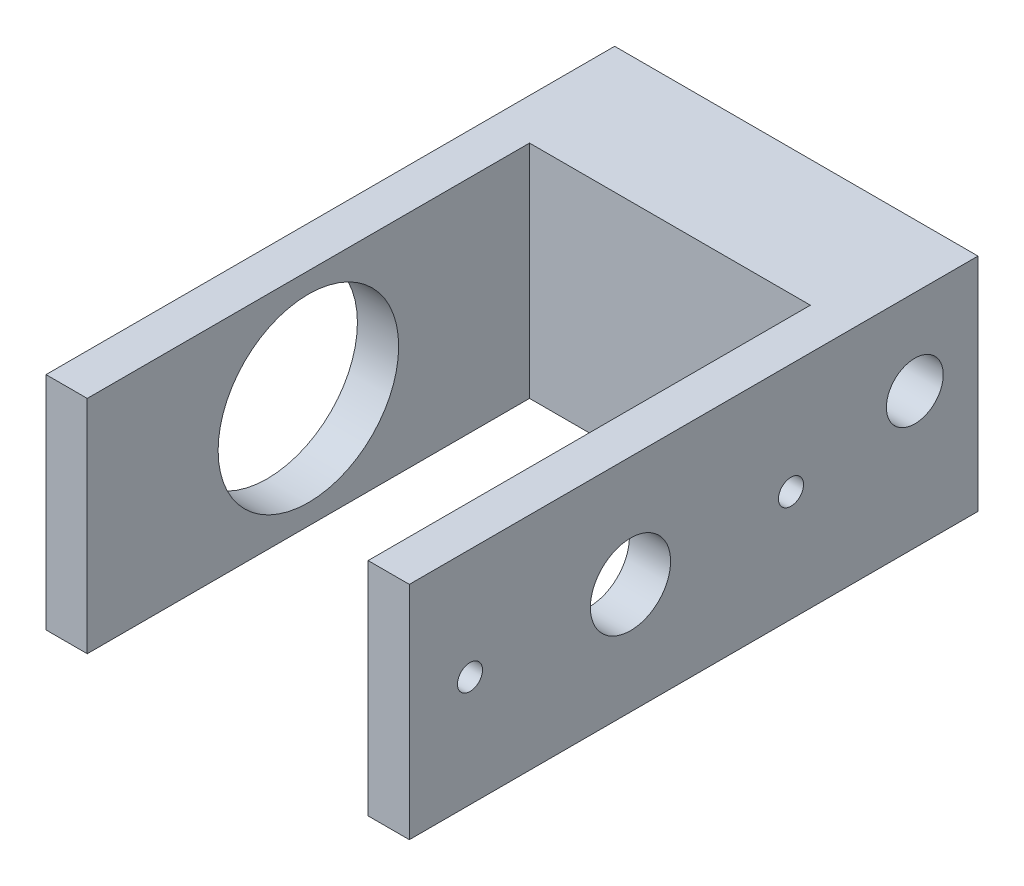
ISO-10303-21;
HEADER;
FILE_DESCRIPTION(('STEP AP214'),'2;1');
FILE_NAME('part.step','',(''),(''),'','','');
FILE_SCHEMA(('AUTOMOTIVE_DESIGN { 1 0 10303 214 1 1 1 1 }'));
ENDSEC;
DATA;
#1=APPLICATION_CONTEXT('core data for automotive mechanical design processes');
#2=APPLICATION_PROTOCOL_DEFINITION('international standard','automotive_design',2000,#1);
#3=PRODUCT_CONTEXT('',#1,'mechanical');
#4=PRODUCT('Part','Part','',(#3));
#5=PRODUCT_RELATED_PRODUCT_CATEGORY('part','',(#4));
#6=PRODUCT_DEFINITION_FORMATION('','',#4);
#7=PRODUCT_DEFINITION_CONTEXT('part definition',#1,'design');
#8=PRODUCT_DEFINITION('design','',#6,#7);
#9=PRODUCT_DEFINITION_SHAPE('','',#8);
#10=(LENGTH_UNIT() NAMED_UNIT(*) SI_UNIT(.MILLI.,.METRE.));
#11=(NAMED_UNIT(*) PLANE_ANGLE_UNIT() SI_UNIT($,.RADIAN.));
#12=(NAMED_UNIT(*) SI_UNIT($,.STERADIAN.) SOLID_ANGLE_UNIT());
#13=UNCERTAINTY_MEASURE_WITH_UNIT(LENGTH_MEASURE(1.E-05),#10,'distance_accuracy_value','');
#14=(GEOMETRIC_REPRESENTATION_CONTEXT(3) GLOBAL_UNCERTAINTY_ASSIGNED_CONTEXT((#13)) GLOBAL_UNIT_ASSIGNED_CONTEXT((#10,
#11,#12)) REPRESENTATION_CONTEXT('',''));
#15=CARTESIAN_POINT('',(0.,0.,0.));
#16=DIRECTION('',(0.,0.,1.));
#17=DIRECTION('',(1.,0.,0.));
#18=AXIS2_PLACEMENT_3D('',#15,#16,#17);
#19=CARTESIAN_POINT('',(6.5278,0.,0.));
#20=DIRECTION('',(1.,0.,0.));
#21=DIRECTION('',(0.,0.,-1.));
#22=AXIS2_PLACEMENT_3D('',#19,#20,#21);
#23=PLANE('',#22);
#24=DIRECTION('',(0.,-1.,0.));
#25=VECTOR('',#24,1.);
#26=CARTESIAN_POINT('',(6.5278,0.,-35.));
#27=LINE('',#26,#25);
#28=CARTESIAN_POINT('',(6.5278,17.5,-35.));
#29=VERTEX_POINT('',#28);
#30=CARTESIAN_POINT('',(6.5278,-17.5,-35.));
#31=VERTEX_POINT('',#30);
#32=EDGE_CURVE('E49',#29,#31,#27,.T.);
#33=ORIENTED_EDGE('',*,*,#32,.F.);
#34=DIRECTION('',(0.,0.,1.));
#35=VECTOR('',#34,1.);
#36=CARTESIAN_POINT('',(6.5278,17.5,35.));
#37=LINE('',#36,#35);
#38=CARTESIAN_POINT('',(6.5278,17.5,35.));
#39=VERTEX_POINT('',#38);
#40=EDGE_CURVE('E54',#29,#39,#37,.T.);
#41=ORIENTED_EDGE('',*,*,#40,.T.);
#42=DIRECTION('',(0.,-1.,0.));
#43=VECTOR('',#42,1.);
#44=CARTESIAN_POINT('',(6.5278,17.5,35.));
#45=LINE('',#44,#43);
#46=CARTESIAN_POINT('',(6.5278,-17.5,35.));
#47=VERTEX_POINT('',#46);
#48=EDGE_CURVE('E85',#39,#47,#45,.T.);
#49=ORIENTED_EDGE('',*,*,#48,.T.);
#50=DIRECTION('',(0.,0.,-1.));
#51=VECTOR('',#50,1.);
#52=CARTESIAN_POINT('',(6.5278,-17.5,35.));
#53=LINE('',#52,#51);
#54=EDGE_CURVE('E140',#47,#31,#53,.T.);
#55=ORIENTED_EDGE('',*,*,#54,.T.);
#56=EDGE_LOOP('',(#33,#41,#49,#55));
#57=FACE_BOUND('',#56,.T.);
#58=CARTESIAN_POINT('',(6.5278,0.,0.));
#59=DIRECTION('',(1.,0.,0.));
#60=DIRECTION('',(0.,0.,-1.));
#61=AXIS2_PLACEMENT_3D('',#58,#59,#60);
#62=CIRCLE('',#61,14.2875);
#63=CARTESIAN_POINT('',(6.5278,0.,14.2875));
#64=VERTEX_POINT('',#63);
#65=EDGE_CURVE('E96',#64,#64,#62,.T.);
#66=ORIENTED_EDGE('',*,*,#65,.F.);
#67=EDGE_LOOP('',(#66));
#68=FACE_BOUND('',#67,.T.);
#69=ADVANCED_FACE('F34',(#57,#68),#23,.T.);
#70=CARTESIAN_POINT('',(0.,0.,0.));
#71=DIRECTION('',(1.,0.,0.));
#72=DIRECTION('',(0.,0.,-1.));
#73=AXIS2_PLACEMENT_3D('',#70,#71,#72);
#74=PLANE('',#73);
#75=DIRECTION('',(0.,-1.,0.));
#76=VECTOR('',#75,1.);
#77=CARTESIAN_POINT('',(0.,17.5,35.));
#78=LINE('',#77,#76);
#79=CARTESIAN_POINT('',(0.,17.5,35.));
#80=VERTEX_POINT('',#79);
#81=CARTESIAN_POINT('',(0.,-17.5,35.));
#82=VERTEX_POINT('',#81);
#83=EDGE_CURVE('E91',#80,#82,#78,.T.);
#84=ORIENTED_EDGE('',*,*,#83,.F.);
#85=DIRECTION('',(0.,0.,1.));
#86=VECTOR('',#85,1.);
#87=CARTESIAN_POINT('',(0.,17.5,35.));
#88=LINE('',#87,#86);
#89=CARTESIAN_POINT('',(0.,17.5,-55.));
#90=VERTEX_POINT('',#89);
#91=EDGE_CURVE('E74',#90,#80,#88,.T.);
#92=ORIENTED_EDGE('',*,*,#91,.F.);
#93=DIRECTION('',(0.,1.,0.));
#94=VECTOR('',#93,1.);
#95=CARTESIAN_POINT('',(0.,17.5,-55.));
#96=LINE('',#95,#94);
#97=CARTESIAN_POINT('',(0.,-17.5,-55.));
#98=VERTEX_POINT('',#97);
#99=EDGE_CURVE('E86',#98,#90,#96,.T.);
#100=ORIENTED_EDGE('',*,*,#99,.F.);
#101=DIRECTION('',(0.,0.,-1.));
#102=VECTOR('',#101,1.);
#103=CARTESIAN_POINT('',(0.,-17.5,35.));
#104=LINE('',#103,#102);
#105=EDGE_CURVE('E95',#82,#98,#104,.T.);
#106=ORIENTED_EDGE('',*,*,#105,.F.);
#107=EDGE_LOOP('',(#84,#92,#100,#106));
#108=FACE_BOUND('',#107,.T.);
#109=CARTESIAN_POINT('',(0.,0.,0.));
#110=DIRECTION('',(1.,0.,0.));
#111=DIRECTION('',(0.,0.,-1.));
#112=AXIS2_PLACEMENT_3D('',#109,#110,#111);
#113=CIRCLE('',#112,14.2875);
#114=CARTESIAN_POINT('',(0.,0.,14.2875));
#115=VERTEX_POINT('',#114);
#116=EDGE_CURVE('E100',#115,#115,#113,.T.);
#117=ORIENTED_EDGE('',*,*,#116,.T.);
#118=EDGE_LOOP('',(#117));
#119=FACE_BOUND('',#118,.T.);
#120=CARTESIAN_POINT('',(0.,4.,-45.));
#121=DIRECTION('',(1.,0.,0.));
#122=DIRECTION('',(0.,0.,-1.));
#123=AXIS2_PLACEMENT_3D('',#120,#121,#122);
#124=CIRCLE('',#123,4.5);
#125=CARTESIAN_POINT('',(0.,4.,-40.5));
#126=VERTEX_POINT('',#125);
#127=EDGE_CURVE('E156',#126,#126,#124,.T.);
#128=ORIENTED_EDGE('',*,*,#127,.T.);
#129=EDGE_LOOP('',(#128));
#130=FACE_BOUND('',#129,.T.);
#131=ADVANCED_FACE('F93',(#108,#119,#130),#74,.F.);
#132=CARTESIAN_POINT('',(6.5278,17.5,35.));
#133=DIRECTION('',(0.,0.,-1.));
#134=DIRECTION('',(-1.,0.,0.));
#135=AXIS2_PLACEMENT_3D('',#132,#133,#134);
#136=PLANE('',#135);
#137=ORIENTED_EDGE('',*,*,#83,.T.);
#138=DIRECTION('',(-1.,0.,0.));
#139=VECTOR('',#138,1.);
#140=CARTESIAN_POINT('',(6.5278,-17.5,35.));
#141=LINE('',#140,#139);
#142=EDGE_CURVE('E11',#47,#82,#141,.T.);
#143=ORIENTED_EDGE('',*,*,#142,.F.);
#144=ORIENTED_EDGE('',*,*,#48,.F.);
#145=DIRECTION('',(-1.,0.,0.));
#146=VECTOR('',#145,1.);
#147=CARTESIAN_POINT('',(6.5278,17.5,35.));
#148=LINE('',#147,#146);
#149=EDGE_CURVE('E77',#39,#80,#148,.T.);
#150=ORIENTED_EDGE('',*,*,#149,.T.);
#151=EDGE_LOOP('',(#137,#143,#144,#150));
#152=FACE_BOUND('',#151,.T.);
#153=ADVANCED_FACE('F36',(#152),#136,.F.);
#154=CARTESIAN_POINT('',(6.5278,-17.5,35.));
#155=DIRECTION('',(0.,1.,0.));
#156=DIRECTION('',(0.,0.,1.));
#157=AXIS2_PLACEMENT_3D('',#154,#155,#156);
#158=PLANE('',#157);
#159=ORIENTED_EDGE('',*,*,#105,.T.);
#160=DIRECTION('',(-1.,0.,0.));
#161=VECTOR('',#160,1.);
#162=CARTESIAN_POINT('',(6.5278,-17.5,-55.));
#163=LINE('',#162,#161);
#164=CARTESIAN_POINT('',(57.5056,-17.5,-55.));
#165=VERTEX_POINT('',#164);
#166=EDGE_CURVE('E42',#165,#98,#163,.T.);
#167=ORIENTED_EDGE('',*,*,#166,.F.);
#168=DIRECTION('',(0.,0.,1.));
#169=VECTOR('',#168,1.);
#170=CARTESIAN_POINT('',(57.5056,-17.5,0.));
#171=LINE('',#170,#169);
#172=CARTESIAN_POINT('',(57.5056,-17.5,35.));
#173=VERTEX_POINT('',#172);
#174=EDGE_CURVE('E120',#165,#173,#171,.T.);
#175=ORIENTED_EDGE('',*,*,#174,.T.);
#176=DIRECTION('',(-1.,0.,0.));
#177=VECTOR('',#176,1.);
#178=CARTESIAN_POINT('',(57.5056,-17.5,35.));
#179=LINE('',#178,#177);
#180=CARTESIAN_POINT('',(50.9778,-17.5,35.));
#181=VERTEX_POINT('',#180);
#182=EDGE_CURVE('E362',#173,#181,#179,.T.);
#183=ORIENTED_EDGE('',*,*,#182,.T.);
#184=DIRECTION('',(0.,0.,1.));
#185=VECTOR('',#184,1.);
#186=CARTESIAN_POINT('',(50.9778,-17.5,0.));
#187=LINE('',#186,#185);
#188=CARTESIAN_POINT('',(50.9778,-17.5,-35.));
#189=VERTEX_POINT('',#188);
#190=EDGE_CURVE('E154',#189,#181,#187,.T.);
#191=ORIENTED_EDGE('',*,*,#190,.F.);
#192=DIRECTION('',(-1.,0.,0.));
#193=VECTOR('',#192,1.);
#194=CARTESIAN_POINT('',(50.9778,-17.5,-35.));
#195=LINE('',#194,#193);
#196=EDGE_CURVE('E146',#189,#31,#195,.T.);
#197=ORIENTED_EDGE('',*,*,#196,.T.);
#198=ORIENTED_EDGE('',*,*,#54,.F.);
#199=ORIENTED_EDGE('',*,*,#142,.T.);
#200=EDGE_LOOP('',(#159,#167,#175,#183,#191,#197,#198,#199));
#201=FACE_BOUND('',#200,.T.);
#202=ADVANCED_FACE('F117',(#201),#158,.F.);
#203=CARTESIAN_POINT('',(6.5278,17.5,-55.));
#204=DIRECTION('',(0.,0.,1.));
#205=DIRECTION('',(1.,0.,0.));
#206=AXIS2_PLACEMENT_3D('',#203,#204,#205);
#207=PLANE('',#206);
#208=ORIENTED_EDGE('',*,*,#99,.T.);
#209=DIRECTION('',(-1.,0.,0.));
#210=VECTOR('',#209,1.);
#211=CARTESIAN_POINT('',(6.5278,17.5,-55.));
#212=LINE('',#211,#210);
#213=CARTESIAN_POINT('',(57.5056,17.5,-55.));
#214=VERTEX_POINT('',#213);
#215=EDGE_CURVE('E81',#214,#90,#212,.T.);
#216=ORIENTED_EDGE('',*,*,#215,.F.);
#217=DIRECTION('',(0.,1.,0.));
#218=VECTOR('',#217,1.);
#219=CARTESIAN_POINT('',(57.5056,0.,-55.));
#220=LINE('',#219,#218);
#221=EDGE_CURVE('E113',#165,#214,#220,.T.);
#222=ORIENTED_EDGE('',*,*,#221,.F.);
#223=ORIENTED_EDGE('',*,*,#166,.T.);
#224=EDGE_LOOP('',(#208,#216,#222,#223));
#225=FACE_BOUND('',#224,.T.);
#226=ADVANCED_FACE('F110',(#225),#207,.F.);
#227=CARTESIAN_POINT('',(6.5278,17.5,35.));
#228=DIRECTION('',(0.,-1.,0.));
#229=DIRECTION('',(0.,0.,-1.));
#230=AXIS2_PLACEMENT_3D('',#227,#228,#229);
#231=PLANE('',#230);
#232=ORIENTED_EDGE('',*,*,#91,.T.);
#233=ORIENTED_EDGE('',*,*,#149,.F.);
#234=ORIENTED_EDGE('',*,*,#40,.F.);
#235=DIRECTION('',(-1.,0.,0.));
#236=VECTOR('',#235,1.);
#237=CARTESIAN_POINT('',(50.9778,17.5,-35.));
#238=LINE('',#237,#236);
#239=CARTESIAN_POINT('',(50.9778,17.5,-35.));
#240=VERTEX_POINT('',#239);
#241=EDGE_CURVE('E149',#240,#29,#238,.T.);
#242=ORIENTED_EDGE('',*,*,#241,.F.);
#243=DIRECTION('',(0.,0.,1.));
#244=VECTOR('',#243,1.);
#245=CARTESIAN_POINT('',(50.9778,17.5,0.));
#246=LINE('',#245,#244);
#247=CARTESIAN_POINT('',(50.9778,17.5,35.));
#248=VERTEX_POINT('',#247);
#249=EDGE_CURVE('E377',#240,#248,#246,.T.);
#250=ORIENTED_EDGE('',*,*,#249,.T.);
#251=DIRECTION('',(-1.,0.,0.));
#252=VECTOR('',#251,1.);
#253=CARTESIAN_POINT('',(57.5056,17.5,35.));
#254=LINE('',#253,#252);
#255=CARTESIAN_POINT('',(57.5056,17.5,35.));
#256=VERTEX_POINT('',#255);
#257=EDGE_CURVE('E151',#256,#248,#254,.T.);
#258=ORIENTED_EDGE('',*,*,#257,.F.);
#259=DIRECTION('',(0.,0.,1.));
#260=VECTOR('',#259,1.);
#261=CARTESIAN_POINT('',(57.5056,17.5,0.));
#262=LINE('',#261,#260);
#263=EDGE_CURVE('E356',#214,#256,#262,.T.);
#264=ORIENTED_EDGE('',*,*,#263,.F.);
#265=ORIENTED_EDGE('',*,*,#215,.T.);
#266=EDGE_LOOP('',(#232,#233,#234,#242,#250,#258,#264,#265));
#267=FACE_BOUND('',#266,.T.);
#268=ADVANCED_FACE('F76',(#267),#231,.F.);
#269=CARTESIAN_POINT('',(6.5278,0.,0.));
#270=DIRECTION('',(-1.,0.,0.));
#271=DIRECTION('',(0.,0.,1.));
#272=AXIS2_PLACEMENT_3D('',#269,#270,#271);
#273=CYLINDRICAL_SURFACE('',#272,14.2875);
#274=CARTESIAN_POINT('',(6.5278,0.,14.2875));
#275=CARTESIAN_POINT('',(6.45980208333333,0.,14.2875));
#276=CARTESIAN_POINT('',(6.39180416666667,0.,14.2875));
#277=CARTESIAN_POINT('',(6.25580833333333,0.,14.2875));
#278=CARTESIAN_POINT('',(6.18781041666667,0.,14.2875));
#279=CARTESIAN_POINT('',(6.05181458333333,0.,14.2875));
#280=CARTESIAN_POINT('',(5.98381666666667,0.,14.2875));
#281=CARTESIAN_POINT('',(5.84782083333333,0.,14.2875));
#282=CARTESIAN_POINT('',(5.77982291666667,0.,14.2875));
#283=CARTESIAN_POINT('',(5.64382708333333,0.,14.2875));
#284=CARTESIAN_POINT('',(5.57582916666667,0.,14.2875));
#285=CARTESIAN_POINT('',(5.43983333333333,0.,14.2875));
#286=CARTESIAN_POINT('',(5.37183541666667,0.,14.2875));
#287=CARTESIAN_POINT('',(5.23583958333333,0.,14.2875));
#288=CARTESIAN_POINT('',(5.16784166666667,0.,14.2875));
#289=CARTESIAN_POINT('',(5.03184583333333,0.,14.2875));
#290=CARTESIAN_POINT('',(4.96384791666667,0.,14.2875));
#291=CARTESIAN_POINT('',(4.82785208333333,0.,14.2875));
#292=CARTESIAN_POINT('',(4.75985416666667,0.,14.2875));
#293=CARTESIAN_POINT('',(4.62385833333333,0.,14.2875));
#294=CARTESIAN_POINT('',(4.55586041666667,0.,14.2875));
#295=CARTESIAN_POINT('',(4.41986458333333,0.,14.2875));
#296=CARTESIAN_POINT('',(4.35186666666667,0.,14.2875));
#297=CARTESIAN_POINT('',(4.21587083333333,0.,14.2875));
#298=CARTESIAN_POINT('',(4.14787291666667,0.,14.2875));
#299=CARTESIAN_POINT('',(4.01187708333333,0.,14.2875));
#300=CARTESIAN_POINT('',(3.94387916666667,0.,14.2875));
#301=CARTESIAN_POINT('',(3.80788333333333,0.,14.2875));
#302=CARTESIAN_POINT('',(3.73988541666667,0.,14.2875));
#303=CARTESIAN_POINT('',(3.60388958333333,0.,14.2875));
#304=CARTESIAN_POINT('',(3.53589166666667,0.,14.2875));
#305=CARTESIAN_POINT('',(3.39989583333333,0.,14.2875));
#306=CARTESIAN_POINT('',(3.33189791666667,0.,14.2875));
#307=CARTESIAN_POINT('',(3.19590208333333,0.,14.2875));
#308=CARTESIAN_POINT('',(3.12790416666667,0.,14.2875));
#309=CARTESIAN_POINT('',(2.99190833333333,0.,14.2875));
#310=CARTESIAN_POINT('',(2.92391041666667,0.,14.2875));
#311=CARTESIAN_POINT('',(2.78791458333333,0.,14.2875));
#312=CARTESIAN_POINT('',(2.71991666666667,0.,14.2875));
#313=CARTESIAN_POINT('',(2.58392083333333,0.,14.2875));
#314=CARTESIAN_POINT('',(2.51592291666667,0.,14.2875));
#315=CARTESIAN_POINT('',(2.37992708333333,0.,14.2875));
#316=CARTESIAN_POINT('',(2.31192916666667,0.,14.2875));
#317=CARTESIAN_POINT('',(2.17593333333333,0.,14.2875));
#318=CARTESIAN_POINT('',(2.10793541666667,0.,14.2875));
#319=CARTESIAN_POINT('',(1.97193958333333,0.,14.2875));
#320=CARTESIAN_POINT('',(1.90394166666667,0.,14.2875));
#321=CARTESIAN_POINT('',(1.76794583333333,0.,14.2875));
#322=CARTESIAN_POINT('',(1.69994791666667,0.,14.2875));
#323=CARTESIAN_POINT('',(1.56395208333333,0.,14.2875));
#324=CARTESIAN_POINT('',(1.49595416666667,0.,14.2875));
#325=CARTESIAN_POINT('',(1.35995833333333,0.,14.2875));
#326=CARTESIAN_POINT('',(1.29196041666667,0.,14.2875));
#327=CARTESIAN_POINT('',(1.15596458333333,0.,14.2875));
#328=CARTESIAN_POINT('',(1.08796666666667,0.,14.2875));
#329=CARTESIAN_POINT('',(0.951970833333332,0.,14.2875));
#330=CARTESIAN_POINT('',(0.883972916666666,0.,14.2875));
#331=CARTESIAN_POINT('',(0.747977083333333,0.,14.2875));
#332=CARTESIAN_POINT('',(0.679979166666666,0.,14.2875));
#333=CARTESIAN_POINT('',(0.543983333333332,0.,14.2875));
#334=CARTESIAN_POINT('',(0.475985416666666,0.,14.2875));
#335=CARTESIAN_POINT('',(0.339989583333333,0.,14.2875));
#336=CARTESIAN_POINT('',(0.271991666666666,0.,14.2875));
#337=CARTESIAN_POINT('',(0.135995833333332,0.,14.2875));
#338=CARTESIAN_POINT('',(0.0679979166666656,0.,14.2875));
#339=CARTESIAN_POINT('',(0.,0.,14.2875));
#340=B_SPLINE_CURVE_WITH_KNOTS('',3,(#274,#275,#276,#277,#278,#279,#280,#281,#282,#283,#284,
#285,#286,#287,#288,#289,#290,#291,#292,#293,#294,#295,#296,#297,#298,#299,#300,#301,#302,#303,
#304,#305,#306,#307,#308,#309,#310,#311,#312,#313,#314,#315,#316,#317,#318,#319,#320,#321,#322,
#323,#324,#325,#326,#327,#328,#329,#330,#331,#332,#333,#334,#335,#336,#337,#338,#339),
.UNSPECIFIED.,.F.,.F.,(4,2,2,2,2,2,2,2,2,2,2,2,2,2,2,2,2,2,2,2,2,2,2,2,2,2,2,2,2,2,2,2,4),(0.,
0.203993750000001,0.407987500000001,0.611981250000001,0.815975000000001,1.01996875,1.2239625,
1.42795625,1.63195,1.83594375,2.0399375,2.24393125,2.447925,2.65191875,2.8559125,3.05990625,
3.2639,3.46789375,3.6718875,3.87588125,4.079875,4.28386875,4.4878625,4.69185625,4.89585,
5.09984375,5.3038375,5.50783125,5.711825,5.91581875,6.1198125,6.32380625,6.5278),.UNSPECIFIED.);
#341=EDGE_CURVE('BSEAM167',#64,#115,#340,.T.);
#342=ORIENTED_EDGE('',*,*,#65,.T.);
#343=ORIENTED_EDGE('',*,*,#116,.F.);
#344=ORIENTED_EDGE('',*,*,#341,.T.);
#345=ORIENTED_EDGE('',*,*,#341,.F.);
#346=EDGE_LOOP('',(#342,#344,#343,#345));
#347=FACE_BOUND('',#346,.T.);
#348=ADVANCED_FACE('F167',(#347),#273,.F.);
#349=CARTESIAN_POINT('',(6.5278,4.,-45.));
#350=DIRECTION('',(-1.,0.,0.));
#351=DIRECTION('',(0.,0.,1.));
#352=AXIS2_PLACEMENT_3D('',#349,#350,#351);
#353=CYLINDRICAL_SURFACE('',#352,4.5);
#354=CARTESIAN_POINT('',(57.5056,4.,-45.));
#355=DIRECTION('',(1.,0.,0.));
#356=DIRECTION('',(0.,0.,-1.));
#357=AXIS2_PLACEMENT_3D('',#354,#355,#356);
#358=CIRCLE('',#357,4.5);
#359=CARTESIAN_POINT('',(57.5056,4.,-40.5));
#360=VERTEX_POINT('',#359);
#361=EDGE_CURVE('E360',#360,#360,#358,.F.);
#362=CARTESIAN_POINT('',(0.,4.,-40.5));
#363=CARTESIAN_POINT('',(0.599016666666666,4.,-40.5));
#364=CARTESIAN_POINT('',(1.19803333333333,4.,-40.5));
#365=CARTESIAN_POINT('',(2.39606666666667,4.,-40.5));
#366=CARTESIAN_POINT('',(2.99508333333333,4.,-40.5));
#367=CARTESIAN_POINT('',(4.19311666666667,4.,-40.5));
#368=CARTESIAN_POINT('',(4.79213333333333,4.,-40.5));
#369=CARTESIAN_POINT('',(5.99016666666667,4.,-40.5));
#370=CARTESIAN_POINT('',(6.58918333333333,4.,-40.5));
#371=CARTESIAN_POINT('',(7.78721666666666,4.,-40.5));
#372=CARTESIAN_POINT('',(8.38623333333333,4.,-40.5));
#373=CARTESIAN_POINT('',(9.58426666666667,4.,-40.5));
#374=CARTESIAN_POINT('',(10.1832833333333,4.,-40.5));
#375=CARTESIAN_POINT('',(11.3813166666667,4.,-40.5));
#376=CARTESIAN_POINT('',(11.9803333333333,4.,-40.5));
#377=CARTESIAN_POINT('',(13.1783666666667,4.,-40.5));
#378=CARTESIAN_POINT('',(13.7773833333333,4.,-40.5));
#379=CARTESIAN_POINT('',(14.9754166666667,4.,-40.5));
#380=CARTESIAN_POINT('',(15.5744333333333,4.,-40.5));
#381=CARTESIAN_POINT('',(16.7724666666667,4.,-40.5));
#382=CARTESIAN_POINT('',(17.3714833333333,4.,-40.5));
#383=CARTESIAN_POINT('',(18.5695166666667,4.,-40.5));
#384=CARTESIAN_POINT('',(19.1685333333333,4.,-40.5));
#385=CARTESIAN_POINT('',(20.3665666666667,4.,-40.5));
#386=CARTESIAN_POINT('',(20.9655833333333,4.,-40.5));
#387=CARTESIAN_POINT('',(22.1636166666667,4.,-40.5));
#388=CARTESIAN_POINT('',(22.7626333333333,4.,-40.5));
#389=CARTESIAN_POINT('',(23.9606666666667,4.,-40.5));
#390=CARTESIAN_POINT('',(24.5596833333333,4.,-40.5));
#391=CARTESIAN_POINT('',(25.7577166666667,4.,-40.5));
#392=CARTESIAN_POINT('',(26.3567333333333,4.,-40.5));
#393=CARTESIAN_POINT('',(27.5547666666667,4.,-40.5));
#394=CARTESIAN_POINT('',(28.1537833333333,4.,-40.5));
#395=CARTESIAN_POINT('',(29.3518166666667,4.,-40.5));
#396=CARTESIAN_POINT('',(29.9508333333333,4.,-40.5));
#397=CARTESIAN_POINT('',(31.1488666666667,4.,-40.5));
#398=CARTESIAN_POINT('',(31.7478833333333,4.,-40.5));
#399=CARTESIAN_POINT('',(32.9459166666667,4.,-40.5));
#400=CARTESIAN_POINT('',(33.5449333333333,4.,-40.5));
#401=CARTESIAN_POINT('',(34.7429666666667,4.,-40.5));
#402=CARTESIAN_POINT('',(35.3419833333333,4.,-40.5));
#403=CARTESIAN_POINT('',(36.5400166666667,4.,-40.5));
#404=CARTESIAN_POINT('',(37.1390333333333,4.,-40.5));
#405=CARTESIAN_POINT('',(38.3370666666667,4.,-40.5));
#406=CARTESIAN_POINT('',(38.9360833333333,4.,-40.5));
#407=CARTESIAN_POINT('',(40.1341166666667,4.,-40.5));
#408=CARTESIAN_POINT('',(40.7331333333333,4.,-40.5));
#409=CARTESIAN_POINT('',(41.9311666666667,4.,-40.5));
#410=CARTESIAN_POINT('',(42.5301833333333,4.,-40.5));
#411=CARTESIAN_POINT('',(43.7282166666667,4.,-40.5));
#412=CARTESIAN_POINT('',(44.3272333333333,4.,-40.5));
#413=CARTESIAN_POINT('',(45.5252666666667,4.,-40.5));
#414=CARTESIAN_POINT('',(46.1242833333333,4.,-40.5));
#415=CARTESIAN_POINT('',(47.3223166666667,4.,-40.5));
#416=CARTESIAN_POINT('',(47.9213333333333,4.,-40.5));
#417=CARTESIAN_POINT('',(49.1193666666667,4.,-40.5));
#418=CARTESIAN_POINT('',(49.7183833333333,4.,-40.5));
#419=CARTESIAN_POINT('',(50.9164166666667,4.,-40.5));
#420=CARTESIAN_POINT('',(51.5154333333333,4.,-40.5));
#421=CARTESIAN_POINT('',(52.7134666666667,4.,-40.5));
#422=CARTESIAN_POINT('',(53.3124833333333,4.,-40.5));
#423=CARTESIAN_POINT('',(54.5105166666667,4.,-40.5));
#424=CARTESIAN_POINT('',(55.1095333333333,4.,-40.5));
#425=CARTESIAN_POINT('',(56.3075666666667,4.,-40.5));
#426=CARTESIAN_POINT('',(56.9065833333333,4.,-40.5));
#427=CARTESIAN_POINT('',(57.5056,4.,-40.5));
#428=B_SPLINE_CURVE_WITH_KNOTS('',3,(#362,#363,#364,#365,#366,#367,#368,#369,#370,#371,#372,
#373,#374,#375,#376,#377,#378,#379,#380,#381,#382,#383,#384,#385,#386,#387,#388,#389,#390,#391,
#392,#393,#394,#395,#396,#397,#398,#399,#400,#401,#402,#403,#404,#405,#406,#407,#408,#409,#410,
#411,#412,#413,#414,#415,#416,#417,#418,#419,#420,#421,#422,#423,#424,#425,#426,#427),
.UNSPECIFIED.,.F.,.F.,(4,2,2,2,2,2,2,2,2,2,2,2,2,2,2,2,2,2,2,2,2,2,2,2,2,2,2,2,2,2,2,2,4),(0.,
1.79705,3.5941,5.39115,7.1882,8.98525,10.7823,12.57935,14.3764,16.17345,17.9705,19.76755,
21.5646,23.36165,25.1587,26.95575,28.7528,30.54985,32.3469,34.14395,35.941,37.73805,39.5351,
41.33215,43.1292,44.92625,46.7233,48.52035,50.3174,52.11445,53.9115,55.70855,57.5056),.UNSPECIFIED.);
#429=EDGE_CURVE('BSEAM169',#126,#360,#428,.T.);
#430=ORIENTED_EDGE('',*,*,#127,.F.);
#431=ORIENTED_EDGE('',*,*,#361,.F.);
#432=ORIENTED_EDGE('',*,*,#429,.T.);
#433=ORIENTED_EDGE('',*,*,#429,.F.);
#434=EDGE_LOOP('',(#430,#432,#431,#433));
#435=FACE_BOUND('',#434,.T.);
#436=ADVANCED_FACE('F169',(#435),#353,.F.);
#437=CARTESIAN_POINT('',(50.9778,0.,-35.));
#438=DIRECTION('',(0.,0.,-1.));
#439=DIRECTION('',(-1.,0.,0.));
#440=AXIS2_PLACEMENT_3D('',#437,#438,#439);
#441=PLANE('',#440);
#442=ORIENTED_EDGE('',*,*,#32,.T.);
#443=ORIENTED_EDGE('',*,*,#196,.F.);
#444=DIRECTION('',(0.,-1.,0.));
#445=VECTOR('',#444,1.);
#446=CARTESIAN_POINT('',(50.9778,0.,-35.));
#447=LINE('',#446,#445);
#448=EDGE_CURVE('E150',#240,#189,#447,.T.);
#449=ORIENTED_EDGE('',*,*,#448,.F.);
#450=ORIENTED_EDGE('',*,*,#241,.T.);
#451=EDGE_LOOP('',(#442,#443,#449,#450));
#452=FACE_BOUND('',#451,.T.);
#453=ADVANCED_FACE('F145',(#452),#441,.F.);
#454=CARTESIAN_POINT('',(50.9778,0.,0.));
#455=DIRECTION('',(1.,0.,0.));
#456=DIRECTION('',(0.,0.,-1.));
#457=AXIS2_PLACEMENT_3D('',#454,#455,#456);
#458=PLANE('',#457);
#459=CARTESIAN_POINT('',(50.9778,0.,25.4));
#460=DIRECTION('',(1.,0.,0.));
#461=DIRECTION('',(0.,0.,-1.));
#462=AXIS2_PLACEMENT_3D('',#459,#460,#461);
#463=CIRCLE('',#462,1.984375);
#464=CARTESIAN_POINT('',(50.9778,0.,27.384375));
#465=VERTEX_POINT('',#464);
#466=EDGE_CURVE('E374',#465,#465,#463,.T.);
#467=ORIENTED_EDGE('',*,*,#466,.T.);
#468=EDGE_LOOP('',(#467));
#469=FACE_BOUND('',#468,.T.);
#470=CARTESIAN_POINT('',(50.9778,0.,0.));
#471=DIRECTION('',(1.,0.,0.));
#472=DIRECTION('',(0.,0.,-1.));
#473=AXIS2_PLACEMENT_3D('',#470,#471,#472);
#474=CIRCLE('',#473,6.35);
#475=CARTESIAN_POINT('',(50.9778,0.,6.35));
#476=VERTEX_POINT('',#475);
#477=EDGE_CURVE('E371',#476,#476,#474,.T.);
#478=ORIENTED_EDGE('',*,*,#477,.T.);
#479=EDGE_LOOP('',(#478));
#480=FACE_BOUND('',#479,.T.);
#481=CARTESIAN_POINT('',(50.9778,0.,-25.4));
#482=DIRECTION('',(1.,0.,0.));
#483=DIRECTION('',(0.,0.,-1.));
#484=AXIS2_PLACEMENT_3D('',#481,#482,#483);
#485=CIRCLE('',#484,1.984375);
#486=CARTESIAN_POINT('',(50.9778,0.,-23.415625));
#487=VERTEX_POINT('',#486);
#488=EDGE_CURVE('E368',#487,#487,#485,.T.);
#489=ORIENTED_EDGE('',*,*,#488,.T.);
#490=EDGE_LOOP('',(#489));
#491=FACE_BOUND('',#490,.T.);
#492=ORIENTED_EDGE('',*,*,#249,.F.);
#493=ORIENTED_EDGE('',*,*,#448,.T.);
#494=ORIENTED_EDGE('',*,*,#190,.T.);
#495=DIRECTION('',(0.,1.,0.));
#496=VECTOR('',#495,1.);
#497=CARTESIAN_POINT('',(50.9778,0.,35.));
#498=LINE('',#497,#496);
#499=EDGE_CURVE('E379',#181,#248,#498,.T.);
#500=ORIENTED_EDGE('',*,*,#499,.T.);
#501=EDGE_LOOP('',(#492,#493,#494,#500));
#502=FACE_BOUND('',#501,.T.);
#503=ADVANCED_FACE('F251',(#469,#480,#491,#502),#458,.F.);
#504=CARTESIAN_POINT('',(57.5056,0.,35.));
#505=DIRECTION('',(0.,0.,1.));
#506=DIRECTION('',(1.,0.,0.));
#507=AXIS2_PLACEMENT_3D('',#504,#505,#506);
#508=PLANE('',#507);
#509=ORIENTED_EDGE('',*,*,#499,.F.);
#510=ORIENTED_EDGE('',*,*,#182,.F.);
#511=DIRECTION('',(0.,1.,0.));
#512=VECTOR('',#511,1.);
#513=CARTESIAN_POINT('',(57.5056,0.,35.));
#514=LINE('',#513,#512);
#515=EDGE_CURVE('E386',#173,#256,#514,.T.);
#516=ORIENTED_EDGE('',*,*,#515,.T.);
#517=ORIENTED_EDGE('',*,*,#257,.T.);
#518=EDGE_LOOP('',(#509,#510,#516,#517));
#519=FACE_BOUND('',#518,.T.);
#520=ADVANCED_FACE('F281',(#519),#508,.T.);
#521=CARTESIAN_POINT('',(57.5056,0.,25.4));
#522=DIRECTION('',(-1.,0.,0.));
#523=DIRECTION('',(0.,0.,1.));
#524=AXIS2_PLACEMENT_3D('',#521,#522,#523);
#525=CYLINDRICAL_SURFACE('',#524,1.984375);
#526=CARTESIAN_POINT('',(57.5056,0.,25.4));
#527=DIRECTION('',(1.,0.,0.));
#528=DIRECTION('',(0.,0.,-1.));
#529=AXIS2_PLACEMENT_3D('',#526,#527,#528);
#530=CIRCLE('',#529,1.984375);
#531=CARTESIAN_POINT('',(57.5056,0.,27.384375));
#532=VERTEX_POINT('',#531);
#533=EDGE_CURVE('E352',#532,#532,#530,.T.);
#534=CARTESIAN_POINT('',(57.5056,0.,27.384375));
#535=CARTESIAN_POINT('',(57.4376020833333,0.,27.384375));
#536=CARTESIAN_POINT('',(57.3696041666667,0.,27.384375));
#537=CARTESIAN_POINT('',(57.2336083333333,0.,27.384375));
#538=CARTESIAN_POINT('',(57.1656104166667,0.,27.384375));
#539=CARTESIAN_POINT('',(57.0296145833333,0.,27.384375));
#540=CARTESIAN_POINT('',(56.9616166666667,0.,27.384375));
#541=CARTESIAN_POINT('',(56.8256208333333,0.,27.384375));
#542=CARTESIAN_POINT('',(56.7576229166667,0.,27.384375));
#543=CARTESIAN_POINT('',(56.6216270833333,0.,27.384375));
#544=CARTESIAN_POINT('',(56.5536291666667,0.,27.384375));
#545=CARTESIAN_POINT('',(56.4176333333333,0.,27.384375));
#546=CARTESIAN_POINT('',(56.3496354166667,0.,27.384375));
#547=CARTESIAN_POINT('',(56.2136395833333,0.,27.384375));
#548=CARTESIAN_POINT('',(56.1456416666667,0.,27.384375));
#549=CARTESIAN_POINT('',(56.0096458333333,0.,27.384375));
#550=CARTESIAN_POINT('',(55.9416479166667,0.,27.384375));
#551=CARTESIAN_POINT('',(55.8056520833333,0.,27.384375));
#552=CARTESIAN_POINT('',(55.7376541666667,0.,27.384375));
#553=CARTESIAN_POINT('',(55.6016583333333,0.,27.384375));
#554=CARTESIAN_POINT('',(55.5336604166667,0.,27.384375));
#555=CARTESIAN_POINT('',(55.3976645833333,0.,27.384375));
#556=CARTESIAN_POINT('',(55.3296666666667,0.,27.384375));
#557=CARTESIAN_POINT('',(55.1936708333333,0.,27.384375));
#558=CARTESIAN_POINT('',(55.1256729166667,0.,27.384375));
#559=CARTESIAN_POINT('',(54.9896770833333,0.,27.384375));
#560=CARTESIAN_POINT('',(54.9216791666667,0.,27.384375));
#561=CARTESIAN_POINT('',(54.7856833333333,0.,27.384375));
#562=CARTESIAN_POINT('',(54.7176854166667,0.,27.384375));
#563=CARTESIAN_POINT('',(54.5816895833333,0.,27.384375));
#564=CARTESIAN_POINT('',(54.5136916666667,0.,27.384375));
#565=CARTESIAN_POINT('',(54.3776958333333,0.,27.384375));
#566=CARTESIAN_POINT('',(54.3096979166667,0.,27.384375));
#567=CARTESIAN_POINT('',(54.1737020833333,0.,27.384375));
#568=CARTESIAN_POINT('',(54.1057041666667,0.,27.384375));
#569=CARTESIAN_POINT('',(53.9697083333333,0.,27.384375));
#570=CARTESIAN_POINT('',(53.9017104166667,0.,27.384375));
#571=CARTESIAN_POINT('',(53.7657145833333,0.,27.384375));
#572=CARTESIAN_POINT('',(53.6977166666667,0.,27.384375));
#573=CARTESIAN_POINT('',(53.5617208333333,0.,27.384375));
#574=CARTESIAN_POINT('',(53.4937229166667,0.,27.384375));
#575=CARTESIAN_POINT('',(53.3577270833333,0.,27.384375));
#576=CARTESIAN_POINT('',(53.2897291666667,0.,27.384375));
#577=CARTESIAN_POINT('',(53.1537333333333,0.,27.384375));
#578=CARTESIAN_POINT('',(53.0857354166667,0.,27.384375));
#579=CARTESIAN_POINT('',(52.9497395833333,0.,27.384375));
#580=CARTESIAN_POINT('',(52.8817416666667,0.,27.384375));
#581=CARTESIAN_POINT('',(52.7457458333333,0.,27.384375));
#582=CARTESIAN_POINT('',(52.6777479166667,0.,27.384375));
#583=CARTESIAN_POINT('',(52.5417520833333,0.,27.384375));
#584=CARTESIAN_POINT('',(52.4737541666667,0.,27.384375));
#585=CARTESIAN_POINT('',(52.3377583333333,0.,27.384375));
#586=CARTESIAN_POINT('',(52.2697604166667,0.,27.384375));
#587=CARTESIAN_POINT('',(52.1337645833333,0.,27.384375));
#588=CARTESIAN_POINT('',(52.0657666666667,0.,27.384375));
#589=CARTESIAN_POINT('',(51.9297708333333,0.,27.384375));
#590=CARTESIAN_POINT('',(51.8617729166667,0.,27.384375));
#591=CARTESIAN_POINT('',(51.7257770833333,0.,27.384375));
#592=CARTESIAN_POINT('',(51.6577791666667,0.,27.384375));
#593=CARTESIAN_POINT('',(51.5217833333333,0.,27.384375));
#594=CARTESIAN_POINT('',(51.4537854166667,0.,27.384375));
#595=CARTESIAN_POINT('',(51.3177895833333,0.,27.384375));
#596=CARTESIAN_POINT('',(51.2497916666667,0.,27.384375));
#597=CARTESIAN_POINT('',(51.1137958333333,0.,27.384375));
#598=CARTESIAN_POINT('',(51.0457979166667,0.,27.384375));
#599=CARTESIAN_POINT('',(50.9778,0.,27.384375));
#600=B_SPLINE_CURVE_WITH_KNOTS('',3,(#534,#535,#536,#537,#538,#539,#540,#541,#542,#543,#544,
#545,#546,#547,#548,#549,#550,#551,#552,#553,#554,#555,#556,#557,#558,#559,#560,#561,#562,#563,
#564,#565,#566,#567,#568,#569,#570,#571,#572,#573,#574,#575,#576,#577,#578,#579,#580,#581,#582,
#583,#584,#585,#586,#587,#588,#589,#590,#591,#592,#593,#594,#595,#596,#597,#598,#599),
.UNSPECIFIED.,.F.,.F.,(4,2,2,2,2,2,2,2,2,2,2,2,2,2,2,2,2,2,2,2,2,2,2,2,2,2,2,2,2,2,2,2,4),(0.,
0.203993750000006,0.407987500000005,0.611981250000004,0.815975000000003,1.01996875,1.2239625,
1.42795625,1.63195,1.83594375000001,2.03993750000001,2.24393125,2.447925,2.65191875,2.8559125,
3.05990625,3.2639,3.46789375000001,3.67188750000001,3.87588125,4.079875,4.28386875,4.4878625,
4.69185625,4.89585,5.09984375000001,5.30383750000001,5.50783125,5.711825,5.91581875,6.1198125,
6.32380625,6.5278),.UNSPECIFIED.);
#601=EDGE_CURVE('BSEAM289',#532,#465,#600,.T.);
#602=ORIENTED_EDGE('',*,*,#533,.T.);
#603=ORIENTED_EDGE('',*,*,#466,.F.);
#604=ORIENTED_EDGE('',*,*,#601,.T.);
#605=ORIENTED_EDGE('',*,*,#601,.F.);
#606=EDGE_LOOP('',(#602,#604,#603,#605));
#607=FACE_BOUND('',#606,.T.);
#608=ADVANCED_FACE('F289',(#607),#525,.F.);
#609=CARTESIAN_POINT('',(57.5056,0.,0.));
#610=DIRECTION('',(-1.,0.,0.));
#611=DIRECTION('',(0.,0.,1.));
#612=AXIS2_PLACEMENT_3D('',#609,#610,#611);
#613=CYLINDRICAL_SURFACE('',#612,6.35);
#614=CARTESIAN_POINT('',(57.5056,0.,0.));
#615=DIRECTION('',(1.,0.,0.));
#616=DIRECTION('',(0.,0.,-1.));
#617=AXIS2_PLACEMENT_3D('',#614,#615,#616);
#618=CIRCLE('',#617,6.35);
#619=CARTESIAN_POINT('',(57.5056,0.,6.35));
#620=VERTEX_POINT('',#619);
#621=EDGE_CURVE('E348',#620,#620,#618,.T.);
#622=CARTESIAN_POINT('',(57.5056,0.,6.35));
#623=CARTESIAN_POINT('',(57.4376020833333,0.,6.35));
#624=CARTESIAN_POINT('',(57.3696041666667,0.,6.35));
#625=CARTESIAN_POINT('',(57.2336083333333,0.,6.35));
#626=CARTESIAN_POINT('',(57.1656104166667,0.,6.35));
#627=CARTESIAN_POINT('',(57.0296145833333,0.,6.35));
#628=CARTESIAN_POINT('',(56.9616166666667,0.,6.35));
#629=CARTESIAN_POINT('',(56.8256208333333,0.,6.35));
#630=CARTESIAN_POINT('',(56.7576229166667,0.,6.35));
#631=CARTESIAN_POINT('',(56.6216270833333,0.,6.35));
#632=CARTESIAN_POINT('',(56.5536291666667,0.,6.35));
#633=CARTESIAN_POINT('',(56.4176333333333,0.,6.35));
#634=CARTESIAN_POINT('',(56.3496354166667,0.,6.35));
#635=CARTESIAN_POINT('',(56.2136395833333,0.,6.35));
#636=CARTESIAN_POINT('',(56.1456416666667,0.,6.35));
#637=CARTESIAN_POINT('',(56.0096458333333,0.,6.35));
#638=CARTESIAN_POINT('',(55.9416479166667,0.,6.35));
#639=CARTESIAN_POINT('',(55.8056520833333,0.,6.35));
#640=CARTESIAN_POINT('',(55.7376541666667,0.,6.35));
#641=CARTESIAN_POINT('',(55.6016583333333,0.,6.35));
#642=CARTESIAN_POINT('',(55.5336604166667,0.,6.35));
#643=CARTESIAN_POINT('',(55.3976645833333,0.,6.35));
#644=CARTESIAN_POINT('',(55.3296666666667,0.,6.35));
#645=CARTESIAN_POINT('',(55.1936708333333,0.,6.35));
#646=CARTESIAN_POINT('',(55.1256729166667,0.,6.35));
#647=CARTESIAN_POINT('',(54.9896770833333,0.,6.35));
#648=CARTESIAN_POINT('',(54.9216791666667,0.,6.35));
#649=CARTESIAN_POINT('',(54.7856833333333,0.,6.35));
#650=CARTESIAN_POINT('',(54.7176854166667,0.,6.35));
#651=CARTESIAN_POINT('',(54.5816895833333,0.,6.35));
#652=CARTESIAN_POINT('',(54.5136916666667,0.,6.35));
#653=CARTESIAN_POINT('',(54.3776958333333,0.,6.35));
#654=CARTESIAN_POINT('',(54.3096979166667,0.,6.35));
#655=CARTESIAN_POINT('',(54.1737020833333,0.,6.35));
#656=CARTESIAN_POINT('',(54.1057041666667,0.,6.35));
#657=CARTESIAN_POINT('',(53.9697083333333,0.,6.35));
#658=CARTESIAN_POINT('',(53.9017104166667,0.,6.35));
#659=CARTESIAN_POINT('',(53.7657145833333,0.,6.35));
#660=CARTESIAN_POINT('',(53.6977166666667,0.,6.35));
#661=CARTESIAN_POINT('',(53.5617208333333,0.,6.35));
#662=CARTESIAN_POINT('',(53.4937229166667,0.,6.35));
#663=CARTESIAN_POINT('',(53.3577270833333,0.,6.35));
#664=CARTESIAN_POINT('',(53.2897291666667,0.,6.35));
#665=CARTESIAN_POINT('',(53.1537333333333,0.,6.35));
#666=CARTESIAN_POINT('',(53.0857354166667,0.,6.35));
#667=CARTESIAN_POINT('',(52.9497395833333,0.,6.35));
#668=CARTESIAN_POINT('',(52.8817416666667,0.,6.35));
#669=CARTESIAN_POINT('',(52.7457458333333,0.,6.35));
#670=CARTESIAN_POINT('',(52.6777479166667,0.,6.35));
#671=CARTESIAN_POINT('',(52.5417520833333,0.,6.35));
#672=CARTESIAN_POINT('',(52.4737541666667,0.,6.35));
#673=CARTESIAN_POINT('',(52.3377583333333,0.,6.35));
#674=CARTESIAN_POINT('',(52.2697604166667,0.,6.35));
#675=CARTESIAN_POINT('',(52.1337645833333,0.,6.35));
#676=CARTESIAN_POINT('',(52.0657666666667,0.,6.35));
#677=CARTESIAN_POINT('',(51.9297708333333,0.,6.35));
#678=CARTESIAN_POINT('',(51.8617729166667,0.,6.35));
#679=CARTESIAN_POINT('',(51.7257770833333,0.,6.35));
#680=CARTESIAN_POINT('',(51.6577791666667,0.,6.35));
#681=CARTESIAN_POINT('',(51.5217833333333,0.,6.35));
#682=CARTESIAN_POINT('',(51.4537854166667,0.,6.35));
#683=CARTESIAN_POINT('',(51.3177895833333,0.,6.35));
#684=CARTESIAN_POINT('',(51.2497916666667,0.,6.35));
#685=CARTESIAN_POINT('',(51.1137958333333,0.,6.35));
#686=CARTESIAN_POINT('',(51.0457979166667,0.,6.35));
#687=CARTESIAN_POINT('',(50.9778,0.,6.35));
#688=B_SPLINE_CURVE_WITH_KNOTS('',3,(#622,#623,#624,#625,#626,#627,#628,#629,#630,#631,#632,
#633,#634,#635,#636,#637,#638,#639,#640,#641,#642,#643,#644,#645,#646,#647,#648,#649,#650,#651,
#652,#653,#654,#655,#656,#657,#658,#659,#660,#661,#662,#663,#664,#665,#666,#667,#668,#669,#670,
#671,#672,#673,#674,#675,#676,#677,#678,#679,#680,#681,#682,#683,#684,#685,#686,#687),
.UNSPECIFIED.,.F.,.F.,(4,2,2,2,2,2,2,2,2,2,2,2,2,2,2,2,2,2,2,2,2,2,2,2,2,2,2,2,2,2,2,2,4),(0.,
0.203993750000006,0.407987500000005,0.611981250000004,0.815975000000003,1.01996875,1.2239625,
1.42795625,1.63195,1.83594375000001,2.03993750000001,2.24393125,2.447925,2.65191875,2.8559125,
3.05990625,3.2639,3.46789375000001,3.67188750000001,3.87588125,4.079875,4.28386875,4.4878625,
4.69185625,4.89585,5.09984375000001,5.30383750000001,5.50783125,5.711825,5.91581875,6.1198125,
6.32380625,6.5278),.UNSPECIFIED.);
#689=EDGE_CURVE('BSEAM297',#620,#476,#688,.T.);
#690=ORIENTED_EDGE('',*,*,#621,.T.);
#691=ORIENTED_EDGE('',*,*,#477,.F.);
#692=ORIENTED_EDGE('',*,*,#689,.T.);
#693=ORIENTED_EDGE('',*,*,#689,.F.);
#694=EDGE_LOOP('',(#690,#692,#691,#693));
#695=FACE_BOUND('',#694,.T.);
#696=ADVANCED_FACE('F297',(#695),#613,.F.);
#697=CARTESIAN_POINT('',(57.5056,0.,-25.4));
#698=DIRECTION('',(-1.,0.,0.));
#699=DIRECTION('',(0.,0.,1.));
#700=AXIS2_PLACEMENT_3D('',#697,#698,#699);
#701=CYLINDRICAL_SURFACE('',#700,1.984375);
#702=CARTESIAN_POINT('',(57.5056,0.,-25.4));
#703=DIRECTION('',(1.,0.,0.));
#704=DIRECTION('',(0.,0.,-1.));
#705=AXIS2_PLACEMENT_3D('',#702,#703,#704);
#706=CIRCLE('',#705,1.984375);
#707=CARTESIAN_POINT('',(57.5056,0.,-23.415625));
#708=VERTEX_POINT('',#707);
#709=EDGE_CURVE('E344',#708,#708,#706,.T.);
#710=CARTESIAN_POINT('',(57.5056,0.,-23.415625));
#711=CARTESIAN_POINT('',(57.4376020833333,0.,-23.415625));
#712=CARTESIAN_POINT('',(57.3696041666667,0.,-23.415625));
#713=CARTESIAN_POINT('',(57.2336083333333,0.,-23.415625));
#714=CARTESIAN_POINT('',(57.1656104166667,0.,-23.415625));
#715=CARTESIAN_POINT('',(57.0296145833333,0.,-23.415625));
#716=CARTESIAN_POINT('',(56.9616166666667,0.,-23.415625));
#717=CARTESIAN_POINT('',(56.8256208333333,0.,-23.415625));
#718=CARTESIAN_POINT('',(56.7576229166667,0.,-23.415625));
#719=CARTESIAN_POINT('',(56.6216270833333,0.,-23.415625));
#720=CARTESIAN_POINT('',(56.5536291666667,0.,-23.415625));
#721=CARTESIAN_POINT('',(56.4176333333333,0.,-23.415625));
#722=CARTESIAN_POINT('',(56.3496354166667,0.,-23.415625));
#723=CARTESIAN_POINT('',(56.2136395833333,0.,-23.415625));
#724=CARTESIAN_POINT('',(56.1456416666667,0.,-23.415625));
#725=CARTESIAN_POINT('',(56.0096458333333,0.,-23.415625));
#726=CARTESIAN_POINT('',(55.9416479166667,0.,-23.415625));
#727=CARTESIAN_POINT('',(55.8056520833333,0.,-23.415625));
#728=CARTESIAN_POINT('',(55.7376541666667,0.,-23.415625));
#729=CARTESIAN_POINT('',(55.6016583333333,0.,-23.415625));
#730=CARTESIAN_POINT('',(55.5336604166667,0.,-23.415625));
#731=CARTESIAN_POINT('',(55.3976645833333,0.,-23.415625));
#732=CARTESIAN_POINT('',(55.3296666666667,0.,-23.415625));
#733=CARTESIAN_POINT('',(55.1936708333333,0.,-23.415625));
#734=CARTESIAN_POINT('',(55.1256729166667,0.,-23.415625));
#735=CARTESIAN_POINT('',(54.9896770833333,0.,-23.415625));
#736=CARTESIAN_POINT('',(54.9216791666667,0.,-23.415625));
#737=CARTESIAN_POINT('',(54.7856833333333,0.,-23.415625));
#738=CARTESIAN_POINT('',(54.7176854166667,0.,-23.415625));
#739=CARTESIAN_POINT('',(54.5816895833333,0.,-23.415625));
#740=CARTESIAN_POINT('',(54.5136916666667,0.,-23.415625));
#741=CARTESIAN_POINT('',(54.3776958333333,0.,-23.415625));
#742=CARTESIAN_POINT('',(54.3096979166667,0.,-23.415625));
#743=CARTESIAN_POINT('',(54.1737020833333,0.,-23.415625));
#744=CARTESIAN_POINT('',(54.1057041666667,0.,-23.415625));
#745=CARTESIAN_POINT('',(53.9697083333333,0.,-23.415625));
#746=CARTESIAN_POINT('',(53.9017104166667,0.,-23.415625));
#747=CARTESIAN_POINT('',(53.7657145833333,0.,-23.415625));
#748=CARTESIAN_POINT('',(53.6977166666667,0.,-23.415625));
#749=CARTESIAN_POINT('',(53.5617208333333,0.,-23.415625));
#750=CARTESIAN_POINT('',(53.4937229166667,0.,-23.415625));
#751=CARTESIAN_POINT('',(53.3577270833333,0.,-23.415625));
#752=CARTESIAN_POINT('',(53.2897291666667,0.,-23.415625));
#753=CARTESIAN_POINT('',(53.1537333333333,0.,-23.415625));
#754=CARTESIAN_POINT('',(53.0857354166667,0.,-23.415625));
#755=CARTESIAN_POINT('',(52.9497395833333,0.,-23.415625));
#756=CARTESIAN_POINT('',(52.8817416666667,0.,-23.415625));
#757=CARTESIAN_POINT('',(52.7457458333333,0.,-23.415625));
#758=CARTESIAN_POINT('',(52.6777479166667,0.,-23.415625));
#759=CARTESIAN_POINT('',(52.5417520833333,0.,-23.415625));
#760=CARTESIAN_POINT('',(52.4737541666667,0.,-23.415625));
#761=CARTESIAN_POINT('',(52.3377583333333,0.,-23.415625));
#762=CARTESIAN_POINT('',(52.2697604166667,0.,-23.415625));
#763=CARTESIAN_POINT('',(52.1337645833333,0.,-23.415625));
#764=CARTESIAN_POINT('',(52.0657666666667,0.,-23.415625));
#765=CARTESIAN_POINT('',(51.9297708333333,0.,-23.415625));
#766=CARTESIAN_POINT('',(51.8617729166667,0.,-23.415625));
#767=CARTESIAN_POINT('',(51.7257770833333,0.,-23.415625));
#768=CARTESIAN_POINT('',(51.6577791666667,0.,-23.415625));
#769=CARTESIAN_POINT('',(51.5217833333333,0.,-23.415625));
#770=CARTESIAN_POINT('',(51.4537854166667,0.,-23.415625));
#771=CARTESIAN_POINT('',(51.3177895833333,0.,-23.415625));
#772=CARTESIAN_POINT('',(51.2497916666667,0.,-23.415625));
#773=CARTESIAN_POINT('',(51.1137958333333,0.,-23.415625));
#774=CARTESIAN_POINT('',(51.0457979166667,0.,-23.415625));
#775=CARTESIAN_POINT('',(50.9778,0.,-23.415625));
#776=B_SPLINE_CURVE_WITH_KNOTS('',3,(#710,#711,#712,#713,#714,#715,#716,#717,#718,#719,#720,
#721,#722,#723,#724,#725,#726,#727,#728,#729,#730,#731,#732,#733,#734,#735,#736,#737,#738,#739,
#740,#741,#742,#743,#744,#745,#746,#747,#748,#749,#750,#751,#752,#753,#754,#755,#756,#757,#758,
#759,#760,#761,#762,#763,#764,#765,#766,#767,#768,#769,#770,#771,#772,#773,#774,#775),
.UNSPECIFIED.,.F.,.F.,(4,2,2,2,2,2,2,2,2,2,2,2,2,2,2,2,2,2,2,2,2,2,2,2,2,2,2,2,2,2,2,2,4),(0.,
0.203993750000006,0.407987500000005,0.611981250000004,0.815975000000003,1.01996875,1.2239625,
1.42795625,1.63195,1.83594375000001,2.03993750000001,2.24393125,2.447925,2.65191875,2.8559125,
3.05990625,3.2639,3.46789375000001,3.67188750000001,3.87588125,4.079875,4.28386875,4.4878625,
4.69185625,4.89585,5.09984375000001,5.30383750000001,5.50783125,5.711825,5.91581875,6.1198125,
6.32380625,6.5278),.UNSPECIFIED.);
#777=EDGE_CURVE('BSEAM305',#708,#487,#776,.T.);
#778=ORIENTED_EDGE('',*,*,#709,.T.);
#779=ORIENTED_EDGE('',*,*,#488,.F.);
#780=ORIENTED_EDGE('',*,*,#777,.T.);
#781=ORIENTED_EDGE('',*,*,#777,.F.);
#782=EDGE_LOOP('',(#778,#780,#779,#781));
#783=FACE_BOUND('',#782,.T.);
#784=ADVANCED_FACE('F305',(#783),#701,.F.);
#785=CARTESIAN_POINT('',(57.5056,0.,0.));
#786=DIRECTION('',(1.,0.,0.));
#787=DIRECTION('',(0.,0.,-1.));
#788=AXIS2_PLACEMENT_3D('',#785,#786,#787);
#789=PLANE('',#788);
#790=ORIENTED_EDGE('',*,*,#709,.F.);
#791=EDGE_LOOP('',(#790));
#792=FACE_BOUND('',#791,.T.);
#793=ORIENTED_EDGE('',*,*,#621,.F.);
#794=EDGE_LOOP('',(#793));
#795=FACE_BOUND('',#794,.T.);
#796=ORIENTED_EDGE('',*,*,#533,.F.);
#797=EDGE_LOOP('',(#796));
#798=FACE_BOUND('',#797,.T.);
#799=ORIENTED_EDGE('',*,*,#263,.T.);
#800=ORIENTED_EDGE('',*,*,#515,.F.);
#801=ORIENTED_EDGE('',*,*,#174,.F.);
#802=ORIENTED_EDGE('',*,*,#221,.T.);
#803=EDGE_LOOP('',(#799,#800,#801,#802));
#804=FACE_BOUND('',#803,.T.);
#805=ORIENTED_EDGE('',*,*,#361,.T.);
#806=EDGE_LOOP('',(#805));
#807=FACE_BOUND('',#806,.T.);
#808=ADVANCED_FACE('F313',(#792,#795,#798,#804,#807),#789,.T.);
#809=CLOSED_SHELL('',(#69,#131,#153,#202,#226,#268,#348,#436,#453,#503,#520,#608,#696,#784,#808));
#810=MANIFOLD_SOLID_BREP('B2',#809);
#811=ADVANCED_BREP_SHAPE_REPRESENTATION('',(#18,#810),#14);
#812=SHAPE_DEFINITION_REPRESENTATION(#9,#811);
ENDSEC;
END-ISO-10303-21;
